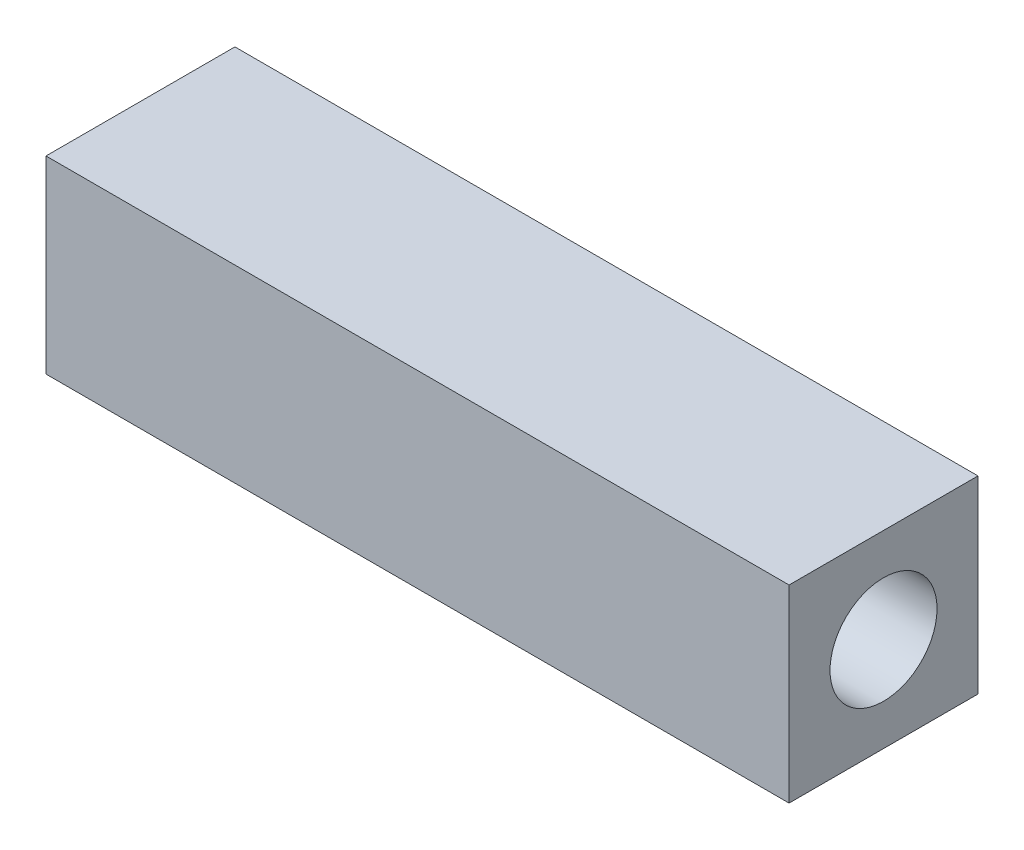
ISO-10303-21;
HEADER;
FILE_DESCRIPTION(('STEP AP214'),'2;1');
FILE_NAME('part.step','',(''),(''),'','','');
FILE_SCHEMA(('AUTOMOTIVE_DESIGN { 1 0 10303 214 1 1 1 1 }'));
ENDSEC;
DATA;
#1=APPLICATION_CONTEXT('core data for automotive mechanical design processes');
#2=APPLICATION_PROTOCOL_DEFINITION('international standard','automotive_design',2000,#1);
#3=PRODUCT_CONTEXT('',#1,'mechanical');
#4=PRODUCT('Part','Part','',(#3));
#5=PRODUCT_RELATED_PRODUCT_CATEGORY('part','',(#4));
#6=PRODUCT_DEFINITION_FORMATION('','',#4);
#7=PRODUCT_DEFINITION_CONTEXT('part definition',#1,'design');
#8=PRODUCT_DEFINITION('design','',#6,#7);
#9=PRODUCT_DEFINITION_SHAPE('','',#8);
#10=(LENGTH_UNIT() NAMED_UNIT(*) SI_UNIT(.MILLI.,.METRE.));
#11=(NAMED_UNIT(*) PLANE_ANGLE_UNIT() SI_UNIT($,.RADIAN.));
#12=(NAMED_UNIT(*) SI_UNIT($,.STERADIAN.) SOLID_ANGLE_UNIT());
#13=UNCERTAINTY_MEASURE_WITH_UNIT(LENGTH_MEASURE(1.E-05),#10,'distance_accuracy_value','');
#14=(GEOMETRIC_REPRESENTATION_CONTEXT(3) GLOBAL_UNCERTAINTY_ASSIGNED_CONTEXT((#13)) GLOBAL_UNIT_ASSIGNED_CONTEXT((#10,
#11,#12)) REPRESENTATION_CONTEXT('',''));
#15=CARTESIAN_POINT('',(0.,0.,0.));
#16=DIRECTION('',(0.,0.,1.));
#17=DIRECTION('',(1.,0.,0.));
#18=AXIS2_PLACEMENT_3D('',#15,#16,#17);
#19=CARTESIAN_POINT('',(118.,-15.,15.));
#20=DIRECTION('',(0.,0.,-1.));
#21=DIRECTION('',(-1.,0.,0.));
#22=AXIS2_PLACEMENT_3D('',#19,#20,#21);
#23=PLANE('',#22);
#24=DIRECTION('',(0.,-1.,0.));
#25=VECTOR('',#24,1.);
#26=CARTESIAN_POINT('',(0.,-15.,15.));
#27=LINE('',#26,#25);
#28=CARTESIAN_POINT('',(0.,15.,15.));
#29=VERTEX_POINT('',#28);
#30=CARTESIAN_POINT('',(0.,-15.,15.));
#31=VERTEX_POINT('',#30);
#32=EDGE_CURVE('E101',#29,#31,#27,.T.);
#33=ORIENTED_EDGE('',*,*,#32,.T.);
#34=DIRECTION('',(-1.,0.,0.));
#35=VECTOR('',#34,1.);
#36=CARTESIAN_POINT('',(118.,-15.,15.));
#37=LINE('',#36,#35);
#38=CARTESIAN_POINT('',(118.,-15.,15.));
#39=VERTEX_POINT('',#38);
#40=EDGE_CURVE('E92',#39,#31,#37,.T.);
#41=ORIENTED_EDGE('',*,*,#40,.F.);
#42=DIRECTION('',(0.,-1.,0.));
#43=VECTOR('',#42,1.);
#44=CARTESIAN_POINT('',(118.,-15.,15.));
#45=LINE('',#44,#43);
#46=CARTESIAN_POINT('',(118.,15.,15.));
#47=VERTEX_POINT('',#46);
#48=EDGE_CURVE('E86',#47,#39,#45,.T.);
#49=ORIENTED_EDGE('',*,*,#48,.F.);
#50=DIRECTION('',(-1.,0.,0.));
#51=VECTOR('',#50,1.);
#52=CARTESIAN_POINT('',(118.,15.,15.));
#53=LINE('',#52,#51);
#54=EDGE_CURVE('E97',#47,#29,#53,.T.);
#55=ORIENTED_EDGE('',*,*,#54,.T.);
#56=EDGE_LOOP('',(#33,#41,#49,#55));
#57=FACE_BOUND('',#56,.T.);
#58=ADVANCED_FACE('F33',(#57),#23,.F.);
#59=CARTESIAN_POINT('',(118.,-15.,-15.));
#60=DIRECTION('',(0.,1.,0.));
#61=DIRECTION('',(0.,0.,1.));
#62=AXIS2_PLACEMENT_3D('',#59,#60,#61);
#63=PLANE('',#62);
#64=DIRECTION('',(0.,0.,-1.));
#65=VECTOR('',#64,1.);
#66=CARTESIAN_POINT('',(0.,-15.,-15.));
#67=LINE('',#66,#65);
#68=CARTESIAN_POINT('',(0.,-15.,-15.));
#69=VERTEX_POINT('',#68);
#70=EDGE_CURVE('E91',#31,#69,#67,.T.);
#71=ORIENTED_EDGE('',*,*,#70,.T.);
#72=DIRECTION('',(-1.,0.,0.));
#73=VECTOR('',#72,1.);
#74=CARTESIAN_POINT('',(118.,-15.,-15.));
#75=LINE('',#74,#73);
#76=CARTESIAN_POINT('',(118.,-15.,-15.));
#77=VERTEX_POINT('',#76);
#78=EDGE_CURVE('E89',#77,#69,#75,.T.);
#79=ORIENTED_EDGE('',*,*,#78,.F.);
#80=DIRECTION('',(0.,0.,-1.));
#81=VECTOR('',#80,1.);
#82=CARTESIAN_POINT('',(118.,-15.,-15.));
#83=LINE('',#82,#81);
#84=EDGE_CURVE('E81',#39,#77,#83,.T.);
#85=ORIENTED_EDGE('',*,*,#84,.F.);
#86=ORIENTED_EDGE('',*,*,#40,.T.);
#87=EDGE_LOOP('',(#71,#79,#85,#86));
#88=FACE_BOUND('',#87,.T.);
#89=ADVANCED_FACE('F90',(#88),#63,.F.);
#90=CARTESIAN_POINT('',(118.,-15.,-15.));
#91=DIRECTION('',(0.,0.,1.));
#92=DIRECTION('',(1.,0.,0.));
#93=AXIS2_PLACEMENT_3D('',#90,#91,#92);
#94=PLANE('',#93);
#95=DIRECTION('',(0.,1.,0.));
#96=VECTOR('',#95,1.);
#97=CARTESIAN_POINT('',(0.,-15.,-15.));
#98=LINE('',#97,#96);
#99=CARTESIAN_POINT('',(0.,15.,-15.));
#100=VERTEX_POINT('',#99);
#101=EDGE_CURVE('E67',#69,#100,#98,.T.);
#102=ORIENTED_EDGE('',*,*,#101,.T.);
#103=DIRECTION('',(-1.,0.,0.));
#104=VECTOR('',#103,1.);
#105=CARTESIAN_POINT('',(118.,15.,-15.));
#106=LINE('',#105,#104);
#107=CARTESIAN_POINT('',(118.,15.,-15.));
#108=VERTEX_POINT('',#107);
#109=EDGE_CURVE('E93',#108,#100,#106,.T.);
#110=ORIENTED_EDGE('',*,*,#109,.F.);
#111=DIRECTION('',(0.,1.,0.));
#112=VECTOR('',#111,1.);
#113=CARTESIAN_POINT('',(118.,-15.,-15.));
#114=LINE('',#113,#112);
#115=EDGE_CURVE('E84',#77,#108,#114,.T.);
#116=ORIENTED_EDGE('',*,*,#115,.F.);
#117=ORIENTED_EDGE('',*,*,#78,.T.);
#118=EDGE_LOOP('',(#102,#110,#116,#117));
#119=FACE_BOUND('',#118,.T.);
#120=ADVANCED_FACE('F95',(#119),#94,.F.);
#121=CARTESIAN_POINT('',(118.,15.,-15.));
#122=DIRECTION('',(0.,-1.,0.));
#123=DIRECTION('',(0.,0.,-1.));
#124=AXIS2_PLACEMENT_3D('',#121,#122,#123);
#125=PLANE('',#124);
#126=DIRECTION('',(0.,0.,1.));
#127=VECTOR('',#126,1.);
#128=CARTESIAN_POINT('',(0.,15.,-15.));
#129=LINE('',#128,#127);
#130=EDGE_CURVE('E73',#100,#29,#129,.T.);
#131=ORIENTED_EDGE('',*,*,#130,.T.);
#132=ORIENTED_EDGE('',*,*,#54,.F.);
#133=DIRECTION('',(0.,0.,1.));
#134=VECTOR('',#133,1.);
#135=CARTESIAN_POINT('',(118.,15.,-15.));
#136=LINE('',#135,#134);
#137=EDGE_CURVE('E50',#108,#47,#136,.T.);
#138=ORIENTED_EDGE('',*,*,#137,.F.);
#139=ORIENTED_EDGE('',*,*,#109,.T.);
#140=EDGE_LOOP('',(#131,#132,#138,#139));
#141=FACE_BOUND('',#140,.T.);
#142=ADVANCED_FACE('F202',(#141),#125,.F.);
#143=CARTESIAN_POINT('',(118.,0.,0.));
#144=DIRECTION('',(1.,0.,0.));
#145=DIRECTION('',(0.,0.,-1.));
#146=AXIS2_PLACEMENT_3D('',#143,#144,#145);
#147=PLANE('',#146);
#148=CARTESIAN_POINT('',(118.,0.,0.));
#149=DIRECTION('',(1.,0.,0.));
#150=DIRECTION('',(0.,0.,-1.));
#151=AXIS2_PLACEMENT_3D('',#148,#149,#150);
#152=CIRCLE('',#151,8.5);
#153=CARTESIAN_POINT('',(118.,0.,-8.5));
#154=VERTEX_POINT('',#153);
#155=EDGE_CURVE('E104',#154,#154,#152,.T.);
#156=ORIENTED_EDGE('',*,*,#155,.F.);
#157=EDGE_LOOP('',(#156));
#158=FACE_BOUND('',#157,.T.);
#159=ORIENTED_EDGE('',*,*,#48,.T.);
#160=ORIENTED_EDGE('',*,*,#84,.T.);
#161=ORIENTED_EDGE('',*,*,#115,.T.);
#162=ORIENTED_EDGE('',*,*,#137,.T.);
#163=EDGE_LOOP('',(#159,#160,#161,#162));
#164=FACE_BOUND('',#163,.T.);
#165=ADVANCED_FACE('F82',(#158,#164),#147,.T.);
#166=CARTESIAN_POINT('',(0.,0.,0.));
#167=DIRECTION('',(1.,0.,0.));
#168=DIRECTION('',(0.,0.,-1.));
#169=AXIS2_PLACEMENT_3D('',#166,#167,#168);
#170=PLANE('',#169);
#171=CARTESIAN_POINT('',(0.,0.,0.));
#172=DIRECTION('',(1.,0.,0.));
#173=DIRECTION('',(0.,0.,-1.));
#174=AXIS2_PLACEMENT_3D('',#171,#172,#173);
#175=CIRCLE('',#174,8.5);
#176=CARTESIAN_POINT('',(0.,0.,-8.5));
#177=VERTEX_POINT('',#176);
#178=EDGE_CURVE('E191',#177,#177,#175,.T.);
#179=ORIENTED_EDGE('',*,*,#178,.T.);
#180=EDGE_LOOP('',(#179));
#181=FACE_BOUND('',#180,.T.);
#182=ORIENTED_EDGE('',*,*,#32,.F.);
#183=ORIENTED_EDGE('',*,*,#130,.F.);
#184=ORIENTED_EDGE('',*,*,#101,.F.);
#185=ORIENTED_EDGE('',*,*,#70,.F.);
#186=EDGE_LOOP('',(#182,#183,#184,#185));
#187=FACE_BOUND('',#186,.T.);
#188=ADVANCED_FACE('F201',(#181,#187),#170,.F.);
#189=CARTESIAN_POINT('',(99.,0.,0.));
#190=DIRECTION('',(1.,0.,0.));
#191=DIRECTION('',(0.,0.,-1.));
#192=AXIS2_PLACEMENT_3D('',#189,#190,#191);
#193=CYLINDRICAL_SURFACE('',#192,8.5);
#194=CARTESIAN_POINT('',(100.658312395178,0.,0.));
#195=DIRECTION('',(-1.,0.,0.));
#196=DIRECTION('',(0.,0.,1.));
#197=AXIS2_PLACEMENT_3D('',#194,#195,#196);
#198=CIRCLE('',#197,8.5);
#199=CARTESIAN_POINT('',(100.658312395178,0.,8.5));
#200=VERTEX_POINT('',#199);
#201=EDGE_CURVE('E129',#200,#200,#198,.T.);
#202=ORIENTED_EDGE('',*,*,#201,.T.);
#203=EDGE_LOOP('',(#202));
#204=FACE_BOUND('',#203,.T.);
#205=ORIENTED_EDGE('',*,*,#155,.T.);
#206=EDGE_LOOP('',(#205));
#207=FACE_BOUND('',#206,.T.);
#208=ADVANCED_FACE('F198',(#204,#207),#193,.F.);
#209=CARTESIAN_POINT('',(73.,0.,0.));
#210=DIRECTION('',(1.,0.,0.));
#211=DIRECTION('',(0.,0.,-1.));
#212=AXIS2_PLACEMENT_3D('',#209,#210,#211);
#213=CYLINDRICAL_SURFACE('',#212,9.);
#214=CARTESIAN_POINT('',(98.2603966335214,0.,0.));
#215=DIRECTION('',(1.,0.,0.));
#216=DIRECTION('',(0.,0.,-1.));
#217=AXIS2_PLACEMENT_3D('',#214,#215,#216);
#218=CIRCLE('',#217,9.);
#219=CARTESIAN_POINT('',(98.2603966335213,0.,-9.));
#220=VERTEX_POINT('',#219);
#221=EDGE_CURVE('E42',#220,#220,#218,.T.);
#222=CARTESIAN_POINT('',(75.2360679774998,0.,0.));
#223=DIRECTION('',(-1.,0.,0.));
#224=DIRECTION('',(0.,0.,1.));
#225=AXIS2_PLACEMENT_3D('',#222,#223,#224);
#226=CIRCLE('',#225,9.);
#227=CARTESIAN_POINT('',(75.2360679774998,0.,-9.));
#228=VERTEX_POINT('',#227);
#229=EDGE_CURVE('E120',#228,#228,#226,.T.);
#230=CARTESIAN_POINT('',(98.2603966335213,0.,-9.));
#231=CARTESIAN_POINT('',(98.0205598766878,0.,-9.));
#232=CARTESIAN_POINT('',(97.7807231198542,0.,-9.));
#233=CARTESIAN_POINT('',(97.3010496061871,0.,-9.));
#234=CARTESIAN_POINT('',(97.0612128493536,0.,-9.));
#235=CARTESIAN_POINT('',(96.5815393356864,0.,-9.));
#236=CARTESIAN_POINT('',(96.3417025788529,0.,-9.));
#237=CARTESIAN_POINT('',(95.8620290651858,0.,-9.));
#238=CARTESIAN_POINT('',(95.6221923083522,0.,-9.));
#239=CARTESIAN_POINT('',(95.1425187946851,0.,-9.));
#240=CARTESIAN_POINT('',(94.9026820378515,0.,-9.));
#241=CARTESIAN_POINT('',(94.4230085241844,0.,-9.));
#242=CARTESIAN_POINT('',(94.1831717673509,0.,-9.));
#243=CARTESIAN_POINT('',(93.7034982536837,0.,-9.));
#244=CARTESIAN_POINT('',(93.4636614968502,0.,-9.));
#245=CARTESIAN_POINT('',(92.9839879831831,0.,-9.));
#246=CARTESIAN_POINT('',(92.7441512263495,0.,-9.));
#247=CARTESIAN_POINT('',(92.2644777126824,0.,-9.));
#248=CARTESIAN_POINT('',(92.0246409558488,0.,-9.));
#249=CARTESIAN_POINT('',(91.5449674421817,0.,-9.));
#250=CARTESIAN_POINT('',(91.3051306853482,0.,-9.));
#251=CARTESIAN_POINT('',(90.825457171681,0.,-9.));
#252=CARTESIAN_POINT('',(90.5856204148475,0.,-9.));
#253=CARTESIAN_POINT('',(90.1059469011804,0.,-9.));
#254=CARTESIAN_POINT('',(89.8661101443468,0.,-9.));
#255=CARTESIAN_POINT('',(89.3864366306797,0.,-9.));
#256=CARTESIAN_POINT('',(89.1465998738461,0.,-9.));
#257=CARTESIAN_POINT('',(88.666926360179,0.,-9.));
#258=CARTESIAN_POINT('',(88.4270896033455,0.,-9.));
#259=CARTESIAN_POINT('',(87.9474160896783,0.,-9.));
#260=CARTESIAN_POINT('',(87.7075793328448,0.,-9.));
#261=CARTESIAN_POINT('',(87.2279058191777,0.,-9.));
#262=CARTESIAN_POINT('',(86.9880690623441,0.,-9.));
#263=CARTESIAN_POINT('',(86.508395548677,0.,-9.));
#264=CARTESIAN_POINT('',(86.2685587918435,0.,-9.));
#265=CARTESIAN_POINT('',(85.7888852781763,0.,-9.));
#266=CARTESIAN_POINT('',(85.5490485213428,0.,-9.));
#267=CARTESIAN_POINT('',(85.0693750076757,0.,-9.));
#268=CARTESIAN_POINT('',(84.8295382508421,0.,-9.));
#269=CARTESIAN_POINT('',(84.349864737175,0.,-9.));
#270=CARTESIAN_POINT('',(84.1100279803414,0.,-9.));
#271=CARTESIAN_POINT('',(83.6303544666743,0.,-9.));
#272=CARTESIAN_POINT('',(83.3905177098408,0.,-9.));
#273=CARTESIAN_POINT('',(82.9108441961736,0.,-9.));
#274=CARTESIAN_POINT('',(82.6710074393401,0.,-9.));
#275=CARTESIAN_POINT('',(82.191333925673,0.,-9.));
#276=CARTESIAN_POINT('',(81.9514971688394,0.,-9.));
#277=CARTESIAN_POINT('',(81.4718236551723,0.,-9.));
#278=CARTESIAN_POINT('',(81.2319868983387,0.,-9.));
#279=CARTESIAN_POINT('',(80.7523133846716,0.,-9.));
#280=CARTESIAN_POINT('',(80.5124766278381,0.,-9.));
#281=CARTESIAN_POINT('',(80.0328031141709,0.,-9.));
#282=CARTESIAN_POINT('',(79.7929663573374,0.,-9.));
#283=CARTESIAN_POINT('',(79.3132928436703,0.,-9.));
#284=CARTESIAN_POINT('',(79.0734560868367,0.,-9.));
#285=CARTESIAN_POINT('',(78.5937825731696,0.,-9.));
#286=CARTESIAN_POINT('',(78.3539458163361,0.,-9.));
#287=CARTESIAN_POINT('',(77.8742723026689,0.,-9.));
#288=CARTESIAN_POINT('',(77.6344355458354,0.,-9.));
#289=CARTESIAN_POINT('',(77.1547620321683,0.,-9.));
#290=CARTESIAN_POINT('',(76.9149252753347,0.,-9.));
#291=CARTESIAN_POINT('',(76.4352517616676,0.,-9.));
#292=CARTESIAN_POINT('',(76.195415004834,0.,-9.));
#293=CARTESIAN_POINT('',(75.7157414911669,0.,-9.));
#294=CARTESIAN_POINT('',(75.4759047343334,0.,-9.));
#295=CARTESIAN_POINT('',(75.2360679774998,0.,-9.));
#296=B_SPLINE_CURVE_WITH_KNOTS('',3,(#230,#231,#232,#233,#234,#235,#236,#237,#238,#239,#240,
#241,#242,#243,#244,#245,#246,#247,#248,#249,#250,#251,#252,#253,#254,#255,#256,#257,#258,#259,
#260,#261,#262,#263,#264,#265,#266,#267,#268,#269,#270,#271,#272,#273,#274,#275,#276,#277,#278,
#279,#280,#281,#282,#283,#284,#285,#286,#287,#288,#289,#290,#291,#292,#293,#294,#295),
.UNSPECIFIED.,.F.,.F.,(4,2,2,2,2,2,2,2,2,2,2,2,2,2,2,2,2,2,2,2,2,2,2,2,2,2,2,2,2,2,2,2,4),(0.,
0.71951027050067,1.43902054100134,2.15853081150201,2.87804108200269,3.59755135250336,
4.31706162300403,5.0365718935047,5.75608216400537,6.47559243450606,7.19510270500673,
7.9146129755074,8.63412324600807,9.35363351650875,10.0731437870094,10.7926540575101,
11.5121643280108,12.2316745985114,12.9511848690121,13.6706951395128,14.3902054100135,
15.1097156805141,15.8292259510148,16.5487362215155,17.2682464920162,17.9877567625168,
18.7072670330175,19.4267773035182,20.1462875740188,20.8657978445195,21.5853081150202,
22.3048183855209,23.0243286560215),.UNSPECIFIED.);
#297=EDGE_CURVE('BSEAM134',#220,#228,#296,.T.);
#298=ORIENTED_EDGE('',*,*,#221,.T.);
#299=ORIENTED_EDGE('',*,*,#229,.T.);
#300=ORIENTED_EDGE('',*,*,#297,.T.);
#301=ORIENTED_EDGE('',*,*,#297,.F.);
#302=EDGE_LOOP('',(#298,#300,#299,#301));
#303=FACE_BOUND('',#302,.T.);
#304=ADVANCED_FACE('F134',(#303),#213,.F.);
#305=CARTESIAN_POINT('',(41.,0.,0.));
#306=DIRECTION('',(1.,0.,0.));
#307=DIRECTION('',(0.,0.,-1.));
#308=AXIS2_PLACEMENT_3D('',#305,#306,#307);
#309=CYLINDRICAL_SURFACE('',#308,10.);
#310=CARTESIAN_POINT('',(71.9194431871444,0.,0.));
#311=DIRECTION('',(1.,0.,0.));
#312=DIRECTION('',(0.,0.,-1.));
#313=AXIS2_PLACEMENT_3D('',#310,#311,#312);
#314=CIRCLE('',#313,10.);
#315=CARTESIAN_POINT('',(71.9194431871444,0.,-10.));
#316=VERTEX_POINT('',#315);
#317=EDGE_CURVE('E123',#316,#316,#314,.T.);
#318=ORIENTED_EDGE('',*,*,#317,.T.);
#319=EDGE_LOOP('',(#318));
#320=FACE_BOUND('',#319,.T.);
#321=CARTESIAN_POINT('',(41.7943509500647,0.,0.));
#322=DIRECTION('',(1.,0.,0.));
#323=DIRECTION('',(0.,0.,-1.));
#324=AXIS2_PLACEMENT_3D('',#321,#322,#323);
#325=CIRCLE('',#324,10.);
#326=CARTESIAN_POINT('',(41.7943509500647,0.,-10.));
#327=VERTEX_POINT('',#326);
#328=EDGE_CURVE('E117',#327,#327,#325,.F.);
#329=ORIENTED_EDGE('',*,*,#328,.T.);
#330=EDGE_LOOP('',(#329));
#331=FACE_BOUND('',#330,.T.);
#332=ADVANCED_FACE('F176',(#320,#331),#309,.F.);
#333=CARTESIAN_POINT('',(-3.,0.,0.));
#334=DIRECTION('',(1.,0.,0.));
#335=DIRECTION('',(0.,0.,-1.));
#336=AXIS2_PLACEMENT_3D('',#333,#334,#335);
#337=CYLINDRICAL_SURFACE('',#336,8.5);
#338=CARTESIAN_POINT('',(35.7321731235736,0.,0.));
#339=DIRECTION('',(1.,0.,0.));
#340=DIRECTION('',(0.,0.,-1.));
#341=AXIS2_PLACEMENT_3D('',#338,#339,#340);
#342=CIRCLE('',#341,8.5);
#343=CARTESIAN_POINT('',(35.7321731235736,0.,-8.5));
#344=VERTEX_POINT('',#343);
#345=EDGE_CURVE('E111',#344,#344,#342,.T.);
#346=ORIENTED_EDGE('',*,*,#345,.T.);
#347=EDGE_LOOP('',(#346));
#348=FACE_BOUND('',#347,.T.);
#349=ORIENTED_EDGE('',*,*,#178,.F.);
#350=EDGE_LOOP('',(#349));
#351=FACE_BOUND('',#350,.T.);
#352=ADVANCED_FACE('F159',(#348,#351),#337,.F.);
#353=CARTESIAN_POINT('',(35.7321731235736,0.,0.));
#354=DIRECTION('',(1.,0.,0.));
#355=DIRECTION('',(0.,0.,-1.));
#356=AXIS2_PLACEMENT_3D('',#353,#354,#355);
#357=TOROIDAL_SURFACE('',#356,18.5,10.);
#358=CARTESIAN_POINT('',(40.3953868362591,0.,0.));
#359=DIRECTION('',(-1.,0.,0.));
#360=DIRECTION('',(0.,0.,1.));
#361=AXIS2_PLACEMENT_3D('',#358,#359,#360);
#362=CIRCLE('',#361,9.65384615384615);
#363=CARTESIAN_POINT('',(40.3953868362591,0.,9.65384615384615));
#364=VERTEX_POINT('',#363);
#365=EDGE_CURVE('E114',#364,#364,#362,.F.);
#366=ORIENTED_EDGE('',*,*,#365,.T.);
#367=EDGE_LOOP('',(#366));
#368=FACE_BOUND('',#367,.T.);
#369=ORIENTED_EDGE('',*,*,#345,.F.);
#370=EDGE_LOOP('',(#369));
#371=FACE_BOUND('',#370,.T.);
#372=ADVANCED_FACE('F155',(#368,#371),#357,.T.);
#373=CARTESIAN_POINT('',(41.7943509500647,0.,0.));
#374=DIRECTION('',(1.,0.,0.));
#375=DIRECTION('',(0.,0.,-1.));
#376=AXIS2_PLACEMENT_3D('',#373,#374,#375);
#377=TOROIDAL_SURFACE('',#376,7.,3.);
#378=ORIENTED_EDGE('',*,*,#328,.F.);
#379=EDGE_LOOP('',(#378));
#380=FACE_BOUND('',#379,.T.);
#381=ORIENTED_EDGE('',*,*,#365,.F.);
#382=EDGE_LOOP('',(#381));
#383=FACE_BOUND('',#382,.T.);
#384=ADVANCED_FACE('F158',(#380,#383),#377,.F.);
#385=CARTESIAN_POINT('',(75.2360679774998,0.,0.));
#386=DIRECTION('',(-1.,0.,0.));
#387=DIRECTION('',(0.,0.,1.));
#388=AXIS2_PLACEMENT_3D('',#385,#386,#387);
#389=TOROIDAL_SURFACE('',#388,12.,3.);
#390=CARTESIAN_POINT('',(73.5777555823221,0.,0.));
#391=DIRECTION('',(1.,0.,0.));
#392=DIRECTION('',(0.,0.,-1.));
#393=AXIS2_PLACEMENT_3D('',#390,#391,#392);
#394=CIRCLE('',#393,9.50000000000001);
#395=CARTESIAN_POINT('',(73.5777555823221,0.,-9.50000000000001));
#396=VERTEX_POINT('',#395);
#397=EDGE_CURVE('E126',#396,#396,#394,.F.);
#398=ORIENTED_EDGE('',*,*,#397,.T.);
#399=EDGE_LOOP('',(#398));
#400=FACE_BOUND('',#399,.T.);
#401=ORIENTED_EDGE('',*,*,#229,.F.);
#402=EDGE_LOOP('',(#401));
#403=FACE_BOUND('',#402,.T.);
#404=ADVANCED_FACE('F163',(#400,#403),#389,.T.);
#405=CARTESIAN_POINT('',(71.9194431871444,0.,0.));
#406=DIRECTION('',(1.,0.,0.));
#407=DIRECTION('',(0.,0.,-1.));
#408=AXIS2_PLACEMENT_3D('',#405,#406,#407);
#409=TOROIDAL_SURFACE('',#408,7.,3.);
#410=ORIENTED_EDGE('',*,*,#397,.F.);
#411=EDGE_LOOP('',(#410));
#412=FACE_BOUND('',#411,.T.);
#413=ORIENTED_EDGE('',*,*,#317,.F.);
#414=EDGE_LOOP('',(#413));
#415=FACE_BOUND('',#414,.T.);
#416=ADVANCED_FACE('F143',(#412,#415),#409,.F.);
#417=CARTESIAN_POINT('',(100.658312395178,0.,0.));
#418=DIRECTION('',(-1.,0.,0.));
#419=DIRECTION('',(0.,0.,1.));
#420=AXIS2_PLACEMENT_3D('',#417,#418,#419);
#421=TOROIDAL_SURFACE('',#420,11.5,3.);
#422=CARTESIAN_POINT('',(99.4593545143495,0.,0.));
#423=DIRECTION('',(1.,0.,0.));
#424=DIRECTION('',(0.,0.,-1.));
#425=AXIS2_PLACEMENT_3D('',#422,#423,#424);
#426=CIRCLE('',#425,8.75);
#427=CARTESIAN_POINT('',(99.4593545143495,0.,-8.75));
#428=VERTEX_POINT('',#427);
#429=EDGE_CURVE('E11',#428,#428,#426,.F.);
#430=ORIENTED_EDGE('',*,*,#429,.T.);
#431=EDGE_LOOP('',(#430));
#432=FACE_BOUND('',#431,.T.);
#433=ORIENTED_EDGE('',*,*,#201,.F.);
#434=EDGE_LOOP('',(#433));
#435=FACE_BOUND('',#434,.T.);
#436=ADVANCED_FACE('F138',(#432,#435),#421,.T.);
#437=CARTESIAN_POINT('',(98.2603966335214,0.,0.));
#438=DIRECTION('',(1.,0.,0.));
#439=DIRECTION('',(0.,0.,-1.));
#440=AXIS2_PLACEMENT_3D('',#437,#438,#439);
#441=TOROIDAL_SURFACE('',#440,6.,3.);
#442=ORIENTED_EDGE('',*,*,#429,.F.);
#443=EDGE_LOOP('',(#442));
#444=FACE_BOUND('',#443,.T.);
#445=ORIENTED_EDGE('',*,*,#221,.F.);
#446=EDGE_LOOP('',(#445));
#447=FACE_BOUND('',#446,.T.);
#448=ADVANCED_FACE('F35',(#444,#447),#441,.F.);
#449=CLOSED_SHELL('',(#58,#89,#120,#142,#165,#188,#208,#304,#332,#352,#372,#384,#404,#416,#436,#448));
#450=MANIFOLD_SOLID_BREP('B2',#449);
#451=ADVANCED_BREP_SHAPE_REPRESENTATION('',(#18,#450),#14);
#452=SHAPE_DEFINITION_REPRESENTATION(#9,#451);
ENDSEC;
END-ISO-10303-21;
